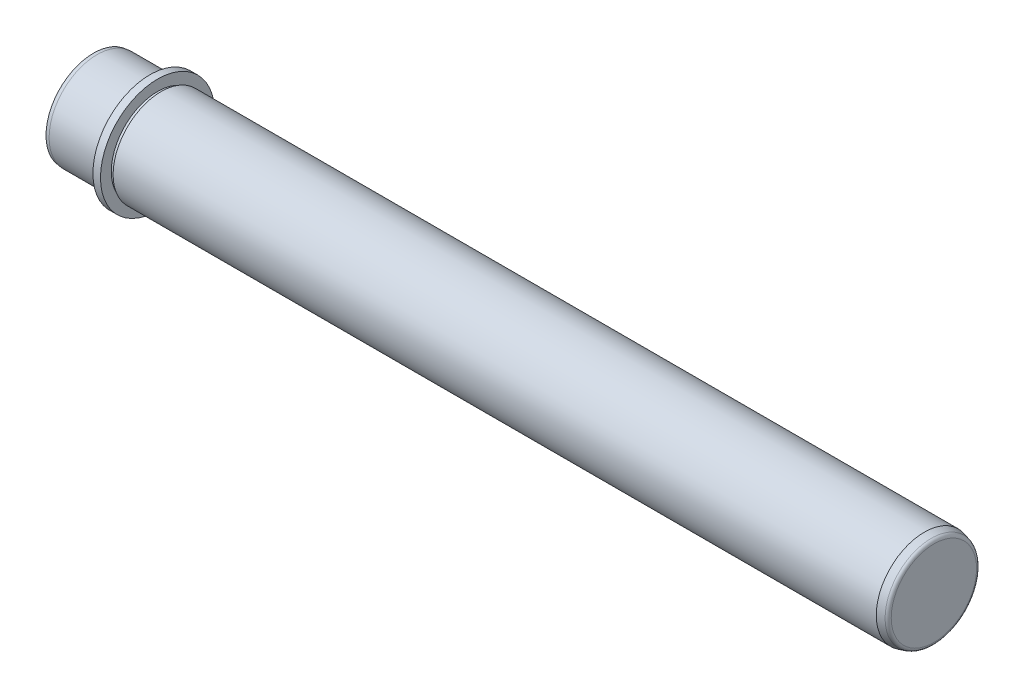
ISO-10303-21;
HEADER;
FILE_DESCRIPTION(('STEP AP214'),'2;1');
FILE_NAME('part.step','',(''),(''),'','','');
FILE_SCHEMA(('AUTOMOTIVE_DESIGN { 1 0 10303 214 1 1 1 1 }'));
ENDSEC;
DATA;
#1=APPLICATION_CONTEXT('core data for automotive mechanical design processes');
#2=APPLICATION_PROTOCOL_DEFINITION('international standard','automotive_design',2000,#1);
#3=PRODUCT_CONTEXT('',#1,'mechanical');
#4=PRODUCT('Part','Part','',(#3));
#5=PRODUCT_RELATED_PRODUCT_CATEGORY('part','',(#4));
#6=PRODUCT_DEFINITION_FORMATION('','',#4);
#7=PRODUCT_DEFINITION_CONTEXT('part definition',#1,'design');
#8=PRODUCT_DEFINITION('design','',#6,#7);
#9=PRODUCT_DEFINITION_SHAPE('','',#8);
#10=(LENGTH_UNIT() NAMED_UNIT(*) SI_UNIT(.MILLI.,.METRE.));
#11=(NAMED_UNIT(*) PLANE_ANGLE_UNIT() SI_UNIT($,.RADIAN.));
#12=(NAMED_UNIT(*) SI_UNIT($,.STERADIAN.) SOLID_ANGLE_UNIT());
#13=UNCERTAINTY_MEASURE_WITH_UNIT(LENGTH_MEASURE(1.E-05),#10,'distance_accuracy_value','');
#14=(GEOMETRIC_REPRESENTATION_CONTEXT(3) GLOBAL_UNCERTAINTY_ASSIGNED_CONTEXT((#13)) GLOBAL_UNIT_ASSIGNED_CONTEXT((#10,
#11,#12)) REPRESENTATION_CONTEXT('',''));
#15=CARTESIAN_POINT('',(0.,0.,0.));
#16=DIRECTION('',(0.,0.,1.));
#17=DIRECTION('',(1.,0.,0.));
#18=AXIS2_PLACEMENT_3D('',#15,#16,#17);
#19=CARTESIAN_POINT('',(674.766599394551,35.5544254966142,0.));
#20=DIRECTION('',(-1.,0.,0.));
#21=DIRECTION('',(0.,0.,1.));
#22=AXIS2_PLACEMENT_3D('',#19,#20,#21);
#23=PLANE('',#22);
#24=CARTESIAN_POINT('',(674.766599394551,0.,0.));
#25=DIRECTION('',(-1.,0.,0.));
#26=DIRECTION('',(0.,0.,1.));
#27=AXIS2_PLACEMENT_3D('',#24,#25,#26);
#28=CIRCLE('',#27,35.5544254966142);
#29=CARTESIAN_POINT('',(674.766599394551,0.,35.5544254966142));
#30=VERTEX_POINT('',#29);
#31=EDGE_CURVE('E11',#30,#30,#28,.T.);
#32=ORIENTED_EDGE('',*,*,#31,.F.);
#33=EDGE_LOOP('',(#32));
#34=FACE_BOUND('',#33,.T.);
#35=ADVANCED_FACE('F37',(#34),#23,.F.);
#36=CARTESIAN_POINT('',(671.766599394551,0.,0.));
#37=DIRECTION('',(-1.,0.,0.));
#38=DIRECTION('',(0.,0.,1.));
#39=AXIS2_PLACEMENT_3D('',#36,#37,#38);
#40=TOROIDAL_SURFACE('',#39,35.5544254966142,2.99999999999998);
#41=CARTESIAN_POINT('',(672.543056529859,0.,0.));
#42=DIRECTION('',(-1.,0.,0.));
#43=DIRECTION('',(0.,0.,1.));
#44=AXIS2_PLACEMENT_3D('',#41,#42,#43);
#45=CIRCLE('',#44,38.4522029754814);
#46=CARTESIAN_POINT('',(672.543056529859,0.,38.4522029754814));
#47=VERTEX_POINT('',#46);
#48=EDGE_CURVE('E43',#47,#47,#45,.T.);
#49=ORIENTED_EDGE('',*,*,#48,.F.);
#50=EDGE_LOOP('',(#49));
#51=FACE_BOUND('',#50,.T.);
#52=ORIENTED_EDGE('',*,*,#31,.T.);
#53=EDGE_LOOP('',(#52));
#54=FACE_BOUND('',#53,.T.);
#55=ADVANCED_FACE('F100',(#51,#54),#40,.T.);
#56=CARTESIAN_POINT('',(672.543056529859,0.,0.));
#57=DIRECTION('',(-1.,0.,0.));
#58=DIRECTION('',(0.,0.,1.));
#59=AXIS2_PLACEMENT_3D('',#56,#57,#58);
#60=CONICAL_SURFACE('',#59,38.4522029754814,0.261799387799146);
#61=CARTESIAN_POINT('',(666.766599394551,0.,0.));
#62=DIRECTION('',(-1.,0.,0.));
#63=DIRECTION('',(0.,0.,1.));
#64=AXIS2_PLACEMENT_3D('',#61,#62,#63);
#65=CIRCLE('',#64,40.);
#66=CARTESIAN_POINT('',(666.766599394551,0.,40.));
#67=VERTEX_POINT('',#66);
#68=EDGE_CURVE('E93',#67,#67,#65,.T.);
#69=ORIENTED_EDGE('',*,*,#68,.F.);
#70=EDGE_LOOP('',(#69));
#71=FACE_BOUND('',#70,.T.);
#72=ORIENTED_EDGE('',*,*,#48,.T.);
#73=EDGE_LOOP('',(#72));
#74=FACE_BOUND('',#73,.T.);
#75=ADVANCED_FACE('F98',(#71,#74),#60,.T.);
#76=CARTESIAN_POINT('',(-25.2334006054491,0.,0.));
#77=DIRECTION('',(-1.,0.,0.));
#78=DIRECTION('',(0.,0.,1.));
#79=AXIS2_PLACEMENT_3D('',#76,#77,#78);
#80=CYLINDRICAL_SURFACE('',#79,40.);
#81=CARTESIAN_POINT('',(31.0665993945509,0.,0.));
#82=DIRECTION('',(-1.,0.,0.));
#83=DIRECTION('',(0.,0.,1.));
#84=AXIS2_PLACEMENT_3D('',#81,#82,#83);
#85=CIRCLE('',#84,40.);
#86=CARTESIAN_POINT('',(31.0665993945509,0.,40.));
#87=VERTEX_POINT('',#86);
#88=EDGE_CURVE('E90',#87,#87,#85,.T.);
#89=ORIENTED_EDGE('',*,*,#88,.F.);
#90=EDGE_LOOP('',(#89));
#91=FACE_BOUND('',#90,.T.);
#92=ORIENTED_EDGE('',*,*,#68,.T.);
#93=EDGE_LOOP('',(#92));
#94=FACE_BOUND('',#93,.T.);
#95=ADVANCED_FACE('F118',(#91,#94),#80,.T.);
#96=CARTESIAN_POINT('',(31.0665993945509,38.5,0.));
#97=DIRECTION('',(1.,0.,0.));
#98=DIRECTION('',(0.,0.,-1.));
#99=AXIS2_PLACEMENT_3D('',#96,#97,#98);
#100=PLANE('',#99);
#101=CARTESIAN_POINT('',(31.0665993945509,0.,0.));
#102=DIRECTION('',(-1.,0.,0.));
#103=DIRECTION('',(0.,0.,1.));
#104=AXIS2_PLACEMENT_3D('',#101,#102,#103);
#105=CIRCLE('',#104,38.5);
#106=CARTESIAN_POINT('',(31.0665993945509,0.,38.5));
#107=VERTEX_POINT('',#106);
#108=EDGE_CURVE('E87',#107,#107,#105,.T.);
#109=ORIENTED_EDGE('',*,*,#108,.F.);
#110=EDGE_LOOP('',(#109));
#111=FACE_BOUND('',#110,.T.);
#112=ORIENTED_EDGE('',*,*,#88,.T.);
#113=EDGE_LOOP('',(#112));
#114=FACE_BOUND('',#113,.T.);
#115=ADVANCED_FACE('F126',(#111,#114),#100,.F.);
#116=CARTESIAN_POINT('',(-25.2334006054491,0.,0.));
#117=DIRECTION('',(-1.,0.,0.));
#118=DIRECTION('',(0.,0.,1.));
#119=AXIS2_PLACEMENT_3D('',#116,#117,#118);
#120=CYLINDRICAL_SURFACE('',#119,38.5);
#121=CARTESIAN_POINT('',(28.0665993945509,0.,0.));
#122=DIRECTION('',(-1.,0.,0.));
#123=DIRECTION('',(0.,0.,1.));
#124=AXIS2_PLACEMENT_3D('',#121,#122,#123);
#125=CIRCLE('',#124,38.5);
#126=CARTESIAN_POINT('',(28.0665993945509,0.,38.5));
#127=VERTEX_POINT('',#126);
#128=EDGE_CURVE('E84',#127,#127,#125,.T.);
#129=ORIENTED_EDGE('',*,*,#128,.F.);
#130=EDGE_LOOP('',(#129));
#131=FACE_BOUND('',#130,.T.);
#132=ORIENTED_EDGE('',*,*,#108,.T.);
#133=EDGE_LOOP('',(#132));
#134=FACE_BOUND('',#133,.T.);
#135=ADVANCED_FACE('F134',(#131,#134),#120,.T.);
#136=CARTESIAN_POINT('',(28.0665993945509,47.5,0.));
#137=DIRECTION('',(-1.,0.,0.));
#138=DIRECTION('',(0.,0.,1.));
#139=AXIS2_PLACEMENT_3D('',#136,#137,#138);
#140=PLANE('',#139);
#141=CARTESIAN_POINT('',(28.0665993945509,0.,0.));
#142=DIRECTION('',(-1.,0.,0.));
#143=DIRECTION('',(0.,0.,1.));
#144=AXIS2_PLACEMENT_3D('',#141,#142,#143);
#145=CIRCLE('',#144,47.5);
#146=CARTESIAN_POINT('',(28.0665993945509,0.,47.5));
#147=VERTEX_POINT('',#146);
#148=EDGE_CURVE('E81',#147,#147,#145,.T.);
#149=ORIENTED_EDGE('',*,*,#148,.F.);
#150=EDGE_LOOP('',(#149));
#151=FACE_BOUND('',#150,.T.);
#152=ORIENTED_EDGE('',*,*,#128,.T.);
#153=EDGE_LOOP('',(#152));
#154=FACE_BOUND('',#153,.T.);
#155=ADVANCED_FACE('F142',(#151,#154),#140,.F.);
#156=CARTESIAN_POINT('',(-25.2334006054491,0.,0.));
#157=DIRECTION('',(-1.,0.,0.));
#158=DIRECTION('',(0.,0.,1.));
#159=AXIS2_PLACEMENT_3D('',#156,#157,#158);
#160=CYLINDRICAL_SURFACE('',#159,47.5);
#161=CARTESIAN_POINT('',(21.7665993945509,0.,0.));
#162=DIRECTION('',(-1.,0.,0.));
#163=DIRECTION('',(0.,0.,1.));
#164=AXIS2_PLACEMENT_3D('',#161,#162,#163);
#165=CIRCLE('',#164,47.5);
#166=CARTESIAN_POINT('',(21.7665993945509,0.,47.5));
#167=VERTEX_POINT('',#166);
#168=EDGE_CURVE('E78',#167,#167,#165,.T.);
#169=ORIENTED_EDGE('',*,*,#168,.F.);
#170=EDGE_LOOP('',(#169));
#171=FACE_BOUND('',#170,.T.);
#172=ORIENTED_EDGE('',*,*,#148,.T.);
#173=EDGE_LOOP('',(#172));
#174=FACE_BOUND('',#173,.T.);
#175=ADVANCED_FACE('F150',(#171,#174),#160,.T.);
#176=CARTESIAN_POINT('',(21.7665993945509,38.5,0.));
#177=DIRECTION('',(1.,0.,0.));
#178=DIRECTION('',(0.,0.,-1.));
#179=AXIS2_PLACEMENT_3D('',#176,#177,#178);
#180=PLANE('',#179);
#181=CARTESIAN_POINT('',(21.7665993945509,0.,0.));
#182=DIRECTION('',(-1.,0.,0.));
#183=DIRECTION('',(0.,0.,1.));
#184=AXIS2_PLACEMENT_3D('',#181,#182,#183);
#185=CIRCLE('',#184,38.5);
#186=CARTESIAN_POINT('',(21.7665993945509,0.,38.5));
#187=VERTEX_POINT('',#186);
#188=EDGE_CURVE('E75',#187,#187,#185,.T.);
#189=ORIENTED_EDGE('',*,*,#188,.F.);
#190=EDGE_LOOP('',(#189));
#191=FACE_BOUND('',#190,.T.);
#192=ORIENTED_EDGE('',*,*,#168,.T.);
#193=EDGE_LOOP('',(#192));
#194=FACE_BOUND('',#193,.T.);
#195=ADVANCED_FACE('F158',(#191,#194),#180,.F.);
#196=CARTESIAN_POINT('',(-25.2334006054491,0.,0.));
#197=DIRECTION('',(-1.,0.,0.));
#198=DIRECTION('',(0.,0.,1.));
#199=AXIS2_PLACEMENT_3D('',#196,#197,#198);
#200=CYLINDRICAL_SURFACE('',#199,38.5);
#201=CARTESIAN_POINT('',(18.7665993945509,0.,0.));
#202=DIRECTION('',(-1.,0.,0.));
#203=DIRECTION('',(0.,0.,1.));
#204=AXIS2_PLACEMENT_3D('',#201,#202,#203);
#205=CIRCLE('',#204,38.5);
#206=CARTESIAN_POINT('',(18.7665993945509,0.,38.5));
#207=VERTEX_POINT('',#206);
#208=EDGE_CURVE('E72',#207,#207,#205,.T.);
#209=ORIENTED_EDGE('',*,*,#208,.F.);
#210=EDGE_LOOP('',(#209));
#211=FACE_BOUND('',#210,.T.);
#212=ORIENTED_EDGE('',*,*,#188,.T.);
#213=EDGE_LOOP('',(#212));
#214=FACE_BOUND('',#213,.T.);
#215=ADVANCED_FACE('F166',(#211,#214),#200,.T.);
#216=CARTESIAN_POINT('',(18.7665993945509,40.,0.));
#217=DIRECTION('',(-1.,0.,0.));
#218=DIRECTION('',(0.,0.,1.));
#219=AXIS2_PLACEMENT_3D('',#216,#217,#218);
#220=PLANE('',#219);
#221=CARTESIAN_POINT('',(18.7665993945509,0.,0.));
#222=DIRECTION('',(-1.,0.,0.));
#223=DIRECTION('',(0.,0.,1.));
#224=AXIS2_PLACEMENT_3D('',#221,#222,#223);
#225=CIRCLE('',#224,40.);
#226=CARTESIAN_POINT('',(18.7665993945509,0.,40.));
#227=VERTEX_POINT('',#226);
#228=EDGE_CURVE('E69',#227,#227,#225,.T.);
#229=ORIENTED_EDGE('',*,*,#228,.F.);
#230=EDGE_LOOP('',(#229));
#231=FACE_BOUND('',#230,.T.);
#232=ORIENTED_EDGE('',*,*,#208,.T.);
#233=EDGE_LOOP('',(#232));
#234=FACE_BOUND('',#233,.T.);
#235=ADVANCED_FACE('F174',(#231,#234),#220,.F.);
#236=CARTESIAN_POINT('',(-25.2334006054491,0.,0.));
#237=DIRECTION('',(-1.,0.,0.));
#238=DIRECTION('',(0.,0.,1.));
#239=AXIS2_PLACEMENT_3D('',#236,#237,#238);
#240=CYLINDRICAL_SURFACE('',#239,40.);
#241=CARTESIAN_POINT('',(-22.2334006054491,0.,0.));
#242=DIRECTION('',(-1.,0.,0.));
#243=DIRECTION('',(0.,0.,1.));
#244=AXIS2_PLACEMENT_3D('',#241,#242,#243);
#245=CIRCLE('',#244,40.);
#246=CARTESIAN_POINT('',(-22.2334006054491,0.,40.));
#247=VERTEX_POINT('',#246);
#248=EDGE_CURVE('E60',#247,#247,#245,.T.);
#249=ORIENTED_EDGE('',*,*,#248,.F.);
#250=EDGE_LOOP('',(#249));
#251=FACE_BOUND('',#250,.T.);
#252=ORIENTED_EDGE('',*,*,#228,.T.);
#253=EDGE_LOOP('',(#252));
#254=FACE_BOUND('',#253,.T.);
#255=ADVANCED_FACE('F182',(#251,#254),#240,.T.);
#256=CARTESIAN_POINT('',(-22.2334006054491,0.,0.));
#257=DIRECTION('',(1.,0.,0.));
#258=DIRECTION('',(0.,0.,-1.));
#259=AXIS2_PLACEMENT_3D('',#256,#257,#258);
#260=CONICAL_SURFACE('',#259,40.,0.139626340159547);
#261=CARTESIAN_POINT('',(-25.2334006054491,0.,0.));
#262=DIRECTION('',(-1.,0.,0.));
#263=DIRECTION('',(0.,0.,1.));
#264=AXIS2_PLACEMENT_3D('',#261,#262,#263);
#265=CIRCLE('',#264,39.5783774958928);
#266=CARTESIAN_POINT('',(-25.2334006054491,0.,39.5783774958928));
#267=VERTEX_POINT('',#266);
#268=EDGE_CURVE('E56',#267,#267,#265,.T.);
#269=ORIENTED_EDGE('',*,*,#268,.F.);
#270=EDGE_LOOP('',(#269));
#271=FACE_BOUND('',#270,.T.);
#272=ORIENTED_EDGE('',*,*,#248,.T.);
#273=EDGE_LOOP('',(#272));
#274=FACE_BOUND('',#273,.T.);
#275=ADVANCED_FACE('F190',(#271,#274),#260,.T.);
#276=CARTESIAN_POINT('',(-25.2334006054491,39.5783774958928,0.));
#277=DIRECTION('',(1.,0.,0.));
#278=DIRECTION('',(0.,0.,-1.));
#279=AXIS2_PLACEMENT_3D('',#276,#277,#278);
#280=PLANE('',#279);
#281=CARTESIAN_POINT('',(-25.2334006054491,0.,0.));
#282=DIRECTION('',(-1.,0.,0.));
#283=DIRECTION('',(0.,0.,1.));
#284=AXIS2_PLACEMENT_3D('',#281,#282,#283);
#285=CIRCLE('',#284,6.025);
#286=CARTESIAN_POINT('',(-25.2334006054491,0.,6.025));
#287=VERTEX_POINT('',#286);
#288=EDGE_CURVE('E63',#287,#287,#285,.T.);
#289=ORIENTED_EDGE('',*,*,#288,.F.);
#290=EDGE_LOOP('',(#289));
#291=FACE_BOUND('',#290,.T.);
#292=ORIENTED_EDGE('',*,*,#268,.T.);
#293=EDGE_LOOP('',(#292));
#294=FACE_BOUND('',#293,.T.);
#295=ADVANCED_FACE('F50',(#291,#294),#280,.F.);
#296=CARTESIAN_POINT('',(6.26659939455094,0.,0.));
#297=DIRECTION('',(-1.,0.,0.));
#298=DIRECTION('',(0.,0.,1.));
#299=AXIS2_PLACEMENT_3D('',#296,#297,#298);
#300=CONICAL_SURFACE('',#299,5.24999999999999,1.02974425867665);
#301=CARTESIAN_POINT('',(9.42111764444564,0.,0.));
#302=VERTEX_POINT('',#301);
#303=VERTEX_LOOP('',#302);
#304=FACE_BOUND('',#303,.T.);
#305=CARTESIAN_POINT('',(6.26659939455094,0.,0.));
#306=DIRECTION('',(-1.,0.,0.));
#307=DIRECTION('',(0.,0.,1.));
#308=AXIS2_PLACEMENT_3D('',#305,#306,#307);
#309=CIRCLE('',#308,5.24999999999999);
#310=CARTESIAN_POINT('',(6.26659939455094,0.,5.24999999999999));
#311=VERTEX_POINT('',#310);
#312=EDGE_CURVE('E54',#311,#311,#309,.T.);
#313=ORIENTED_EDGE('',*,*,#312,.T.);
#314=EDGE_LOOP('',(#313));
#315=FACE_BOUND('',#314,.T.);
#316=ADVANCED_FACE('F46',(#304,#315),#300,.F.);
#317=CARTESIAN_POINT('',(-25.2334006054491,0.,0.));
#318=DIRECTION('',(-1.,0.,0.));
#319=DIRECTION('',(0.,0.,1.));
#320=AXIS2_PLACEMENT_3D('',#317,#318,#319);
#321=CYLINDRICAL_SURFACE('',#320,5.25);
#322=ORIENTED_EDGE('',*,*,#312,.F.);
#323=EDGE_LOOP('',(#322));
#324=FACE_BOUND('',#323,.T.);
#325=CARTESIAN_POINT('',(-24.4584006054491,0.,0.));
#326=DIRECTION('',(-1.,0.,0.));
#327=DIRECTION('',(0.,0.,1.));
#328=AXIS2_PLACEMENT_3D('',#325,#326,#327);
#329=CIRCLE('',#328,5.25);
#330=CARTESIAN_POINT('',(-24.4584006054491,0.,5.25));
#331=VERTEX_POINT('',#330);
#332=EDGE_CURVE('E57',#331,#331,#329,.T.);
#333=ORIENTED_EDGE('',*,*,#332,.T.);
#334=EDGE_LOOP('',(#333));
#335=FACE_BOUND('',#334,.T.);
#336=ADVANCED_FACE('F49',(#324,#335),#321,.F.);
#337=CARTESIAN_POINT('',(-25.2334006054491,0.,0.));
#338=DIRECTION('',(-1.,0.,0.));
#339=DIRECTION('',(0.,0.,1.));
#340=AXIS2_PLACEMENT_3D('',#337,#338,#339);
#341=CONICAL_SURFACE('',#340,6.025,0.785398163397449);
#342=ORIENTED_EDGE('',*,*,#332,.F.);
#343=EDGE_LOOP('',(#342));
#344=FACE_BOUND('',#343,.T.);
#345=ORIENTED_EDGE('',*,*,#288,.T.);
#346=EDGE_LOOP('',(#345));
#347=FACE_BOUND('',#346,.T.);
#348=ADVANCED_FACE('F217',(#344,#347),#341,.F.);
#349=CLOSED_SHELL('',(#35,#55,#75,#95,#115,#135,#155,#175,#195,#215,#235,#255,#275,#295,#316,
#336,#348));
#350=MANIFOLD_SOLID_BREP('B2',#349);
#351=ADVANCED_BREP_SHAPE_REPRESENTATION('',(#18,#350),#14);
#352=SHAPE_DEFINITION_REPRESENTATION(#9,#351);
ENDSEC;
END-ISO-10303-21;
